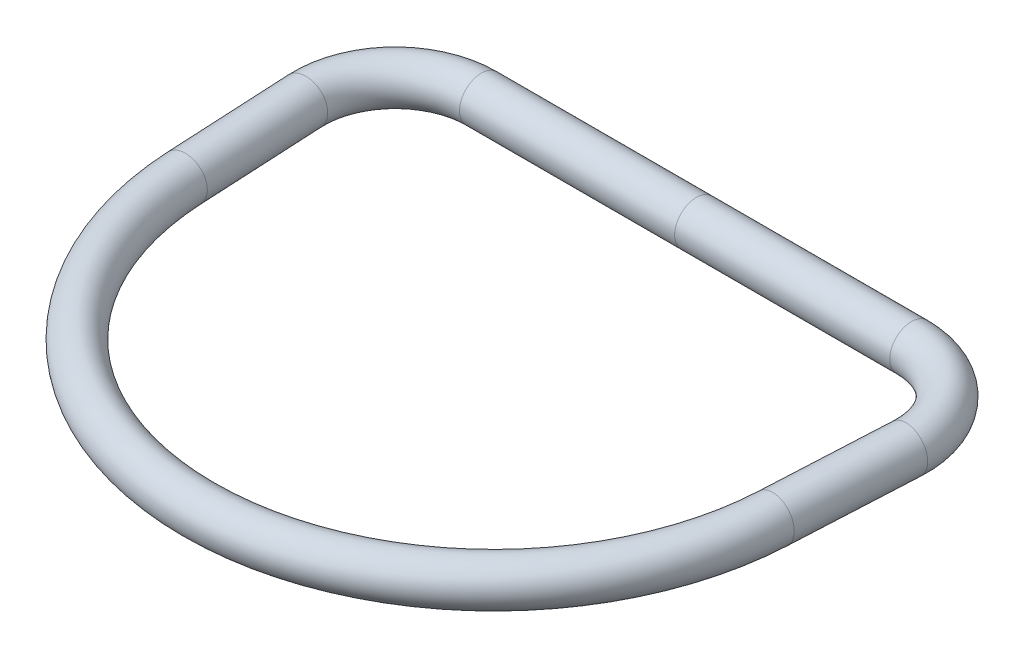
ISO-10303-21;
HEADER;
FILE_DESCRIPTION(('STEP AP214'),'2;1');
FILE_NAME('part.step','',(''),(''),'','','');
FILE_SCHEMA(('AUTOMOTIVE_DESIGN { 1 0 10303 214 1 1 1 1 }'));
ENDSEC;
DATA;
#1=APPLICATION_CONTEXT('core data for automotive mechanical design processes');
#2=APPLICATION_PROTOCOL_DEFINITION('international standard','automotive_design',2000,#1);
#3=PRODUCT_CONTEXT('',#1,'mechanical');
#4=PRODUCT('Part','Part','',(#3));
#5=PRODUCT_RELATED_PRODUCT_CATEGORY('part','',(#4));
#6=PRODUCT_DEFINITION_FORMATION('','',#4);
#7=PRODUCT_DEFINITION_CONTEXT('part definition',#1,'design');
#8=PRODUCT_DEFINITION('design','',#6,#7);
#9=PRODUCT_DEFINITION_SHAPE('','',#8);
#10=(LENGTH_UNIT() NAMED_UNIT(*) SI_UNIT(.MILLI.,.METRE.));
#11=(NAMED_UNIT(*) PLANE_ANGLE_UNIT() SI_UNIT($,.RADIAN.));
#12=(NAMED_UNIT(*) SI_UNIT($,.STERADIAN.) SOLID_ANGLE_UNIT());
#13=UNCERTAINTY_MEASURE_WITH_UNIT(LENGTH_MEASURE(1.E-05),#10,'distance_accuracy_value','');
#14=(GEOMETRIC_REPRESENTATION_CONTEXT(3) GLOBAL_UNCERTAINTY_ASSIGNED_CONTEXT((#13)) GLOBAL_UNIT_ASSIGNED_CONTEXT((#10,
#11,#12)) REPRESENTATION_CONTEXT('',''));
#15=CARTESIAN_POINT('',(0.,0.,0.));
#16=DIRECTION('',(0.,0.,1.));
#17=DIRECTION('',(1.,0.,0.));
#18=AXIS2_PLACEMENT_3D('',#15,#16,#17);
#19=CARTESIAN_POINT('',(0.,-2.64007996799997,-20.391329598695));
#20=DIRECTION('',(-1.,0.,0.));
#21=DIRECTION('',(0.,0.,1.));
#22=AXIS2_PLACEMENT_3D('',#19,#20,#21);
#23=CYLINDRICAL_SURFACE('',#22,3.4925);
#24=CARTESIAN_POINT('',(-34.4254027704859,-2.64007996799997,-20.391329598695));
#25=DIRECTION('',(1.,0.,0.));
#26=DIRECTION('',(0.,0.,-1.));
#27=AXIS2_PLACEMENT_3D('',#24,#25,#26);
#28=CIRCLE('',#27,3.4925);
#29=CARTESIAN_POINT('',(-34.4254027704859,-2.64007996799997,-23.883829598695));
#30=VERTEX_POINT('',#29);
#31=EDGE_CURVE('E54',#30,#30,#28,.T.);
#32=ORIENTED_EDGE('',*,*,#31,.T.);
#33=EDGE_LOOP('',(#32));
#34=FACE_BOUND('',#33,.T.);
#35=CARTESIAN_POINT('',(0.,-2.64007996799997,-20.391329598695));
#36=DIRECTION('',(1.,0.,0.));
#37=DIRECTION('',(0.,0.,-1.));
#38=AXIS2_PLACEMENT_3D('',#35,#36,#37);
#39=CIRCLE('',#38,3.4925);
#40=CARTESIAN_POINT('',(0.,-2.64007996799997,-23.883829598695));
#41=VERTEX_POINT('',#40);
#42=EDGE_CURVE('E57',#41,#41,#39,.T.);
#43=ORIENTED_EDGE('',*,*,#42,.F.);
#44=EDGE_LOOP('',(#43));
#45=FACE_BOUND('',#44,.T.);
#46=ADVANCED_FACE('F31',(#34,#45),#23,.T.);
#47=CARTESIAN_POINT('',(-34.4254027704859,-2.64007996799998,-6.61384696560543));
#48=DIRECTION('',(0.,1.,0.));
#49=DIRECTION('',(0.,0.,1.));
#50=AXIS2_PLACEMENT_3D('',#47,#48,#49);
#51=TOROIDAL_SURFACE('',#50,13.7774826330896,3.4925);
#52=CARTESIAN_POINT('',(-48.1850033020757,-2.64007996799998,-5.91211987039009));
#53=DIRECTION('',(-0.0509328963717933,0.,-0.998702077732484));
#54=DIRECTION('',(-0.998702077732484,0.,0.0509328963717933));
#55=AXIS2_PLACEMENT_3D('',#52,#53,#54);
#56=CIRCLE('',#55,3.4925);
#57=CARTESIAN_POINT('',(-51.6729703085564,-2.64007996799998,-5.7342367298116));
#58=VERTEX_POINT('',#57);
#59=EDGE_CURVE('E51',#58,#58,#56,.T.);
#60=CARTESIAN_POINT('',(-34.4254027704859,-2.64007996799998,-6.61384696560543));
#61=DIRECTION('',(0.,1.,0.));
#62=DIRECTION('',(0.,0.,1.));
#63=AXIS2_PLACEMENT_3D('',#60,#61,#62);
#64=CIRCLE('',#63,17.2699826330896);
#65=EDGE_CURVE('',#30,#58,#64,.T.);
#66=ORIENTED_EDGE('',*,*,#31,.F.);
#67=ORIENTED_EDGE('',*,*,#59,.T.);
#68=ORIENTED_EDGE('',*,*,#65,.T.);
#69=ORIENTED_EDGE('',*,*,#65,.F.);
#70=EDGE_LOOP('',(#66,#68,#67,#69));
#71=FACE_BOUND('',#70,.T.);
#72=ADVANCED_FACE('F64',(#71),#51,.T.);
#73=CARTESIAN_POINT('',(-48.1850033020757,-2.64007996799998,-5.91211987039009));
#74=DIRECTION('',(0.0509328963717913,0.,0.998702077732484));
#75=DIRECTION('',(0.998702077732484,0.,-0.0509328963717913));
#76=AXIS2_PLACEMENT_3D('',#73,#74,#75);
#77=CYLINDRICAL_SURFACE('',#76,3.4925);
#78=CARTESIAN_POINT('',(-47.1488716674288,-2.64007996799998,14.4045495130405));
#79=DIRECTION('',(-0.0509328963717912,0.,-0.998702077732484));
#80=DIRECTION('',(-0.998702077732484,0.,0.0509328963717912));
#81=AXIS2_PLACEMENT_3D('',#78,#79,#80);
#82=CIRCLE('',#81,3.4925);
#83=CARTESIAN_POINT('',(-50.6368386739095,-2.64007996799998,14.582432653619));
#84=VERTEX_POINT('',#83);
#85=EDGE_CURVE('E46',#84,#84,#82,.T.);
#86=ORIENTED_EDGE('',*,*,#85,.T.);
#87=EDGE_LOOP('',(#86));
#88=FACE_BOUND('',#87,.T.);
#89=ORIENTED_EDGE('',*,*,#59,.F.);
#90=EDGE_LOOP('',(#89));
#91=FACE_BOUND('',#90,.T.);
#92=ADVANCED_FACE('F70',(#88,#91),#77,.T.);
#93=CARTESIAN_POINT('',(0.,-2.64007996799998,12.));
#94=DIRECTION('',(0.,1.,0.));
#95=DIRECTION('',(0.,0.,1.));
#96=AXIS2_PLACEMENT_3D('',#93,#94,#95);
#97=TOROIDAL_SURFACE('',#96,47.2101467681719,3.4925);
#98=CARTESIAN_POINT('',(47.1488716674288,-2.64007996799998,14.4045495130405));
#99=DIRECTION('',(-0.0509328963717934,0.,0.998702077732484));
#100=DIRECTION('',(0.998702077732484,0.,0.0509328963717934));
#101=AXIS2_PLACEMENT_3D('',#98,#99,#100);
#102=CIRCLE('',#101,3.4925);
#103=CARTESIAN_POINT('',(50.6368386739095,-2.64007996799998,14.582432653619));
#104=VERTEX_POINT('',#103);
#105=EDGE_CURVE('E42',#104,#104,#102,.T.);
#106=CARTESIAN_POINT('',(0.,-2.64007996799998,12.));
#107=DIRECTION('',(0.,1.,0.));
#108=DIRECTION('',(0.,0.,1.));
#109=AXIS2_PLACEMENT_3D('',#106,#107,#108);
#110=CIRCLE('',#109,50.7026467681719);
#111=EDGE_CURVE('',#84,#104,#110,.T.);
#112=ORIENTED_EDGE('',*,*,#85,.F.);
#113=ORIENTED_EDGE('',*,*,#105,.T.);
#114=ORIENTED_EDGE('',*,*,#111,.T.);
#115=ORIENTED_EDGE('',*,*,#111,.F.);
#116=EDGE_LOOP('',(#112,#114,#113,#115));
#117=FACE_BOUND('',#116,.T.);
#118=ADVANCED_FACE('F76',(#117),#97,.T.);
#119=CARTESIAN_POINT('',(47.1488716674288,-2.64007996799998,14.4045495130405));
#120=DIRECTION('',(0.050932896371792,0.,-0.998702077732484));
#121=DIRECTION('',(-0.998702077732484,0.,-0.050932896371792));
#122=AXIS2_PLACEMENT_3D('',#119,#120,#121);
#123=CYLINDRICAL_SURFACE('',#122,3.4925);
#124=CARTESIAN_POINT('',(48.1850033020757,-2.64007996799998,-5.91211987039011));
#125=DIRECTION('',(-0.0509328963717921,0.,0.998702077732484));
#126=DIRECTION('',(0.998702077732484,0.,0.0509328963717921));
#127=AXIS2_PLACEMENT_3D('',#124,#125,#126);
#128=CIRCLE('',#127,3.4925);
#129=CARTESIAN_POINT('',(51.6729703085564,-2.64007996799998,-5.73423672981162));
#130=VERTEX_POINT('',#129);
#131=EDGE_CURVE('E38',#130,#130,#128,.T.);
#132=ORIENTED_EDGE('',*,*,#131,.T.);
#133=EDGE_LOOP('',(#132));
#134=FACE_BOUND('',#133,.T.);
#135=ORIENTED_EDGE('',*,*,#105,.F.);
#136=EDGE_LOOP('',(#135));
#137=FACE_BOUND('',#136,.T.);
#138=ADVANCED_FACE('F80',(#134,#137),#123,.T.);
#139=CARTESIAN_POINT('',(34.4254027704859,-2.64007996799998,-6.61384696560543));
#140=DIRECTION('',(0.,1.,0.));
#141=DIRECTION('',(0.,0.,1.));
#142=AXIS2_PLACEMENT_3D('',#139,#140,#141);
#143=TOROIDAL_SURFACE('',#142,13.7774826330896,3.4925);
#144=CARTESIAN_POINT('',(34.4254027704859,-2.64007996799997,-20.391329598695));
#145=DIRECTION('',(1.,0.,0.));
#146=DIRECTION('',(0.,0.,-1.));
#147=AXIS2_PLACEMENT_3D('',#144,#145,#146);
#148=CIRCLE('',#147,3.4925);
#149=CARTESIAN_POINT('',(34.4254027704859,-2.64007996799997,-23.883829598695));
#150=VERTEX_POINT('',#149);
#151=EDGE_CURVE('E10',#150,#150,#148,.T.);
#152=CARTESIAN_POINT('',(34.4254027704859,-2.64007996799998,-6.61384696560543));
#153=DIRECTION('',(0.,1.,0.));
#154=DIRECTION('',(0.,0.,1.));
#155=AXIS2_PLACEMENT_3D('',#152,#153,#154);
#156=CIRCLE('',#155,17.2699826330896);
#157=EDGE_CURVE('',#130,#150,#156,.T.);
#158=ORIENTED_EDGE('',*,*,#131,.F.);
#159=ORIENTED_EDGE('',*,*,#151,.T.);
#160=ORIENTED_EDGE('',*,*,#157,.T.);
#161=ORIENTED_EDGE('',*,*,#157,.F.);
#162=EDGE_LOOP('',(#158,#160,#159,#161));
#163=FACE_BOUND('',#162,.T.);
#164=ADVANCED_FACE('F83',(#163),#143,.T.);
#165=CARTESIAN_POINT('',(34.4254027704859,-2.64007996799997,-20.391329598695));
#166=DIRECTION('',(-1.,0.,0.));
#167=DIRECTION('',(0.,0.,1.));
#168=AXIS2_PLACEMENT_3D('',#165,#166,#167);
#169=CYLINDRICAL_SURFACE('',#168,3.4925);
#170=ORIENTED_EDGE('',*,*,#42,.T.);
#171=EDGE_LOOP('',(#170));
#172=FACE_BOUND('',#171,.T.);
#173=ORIENTED_EDGE('',*,*,#151,.F.);
#174=EDGE_LOOP('',(#173));
#175=FACE_BOUND('',#174,.T.);
#176=ADVANCED_FACE('F33',(#172,#175),#169,.T.);
#177=CLOSED_SHELL('',(#46,#72,#92,#118,#138,#164,#176));
#178=MANIFOLD_SOLID_BREP('B2',#177);
#179=ADVANCED_BREP_SHAPE_REPRESENTATION('',(#18,#178),#14);
#180=SHAPE_DEFINITION_REPRESENTATION(#9,#179);
ENDSEC;
END-ISO-10303-21;
